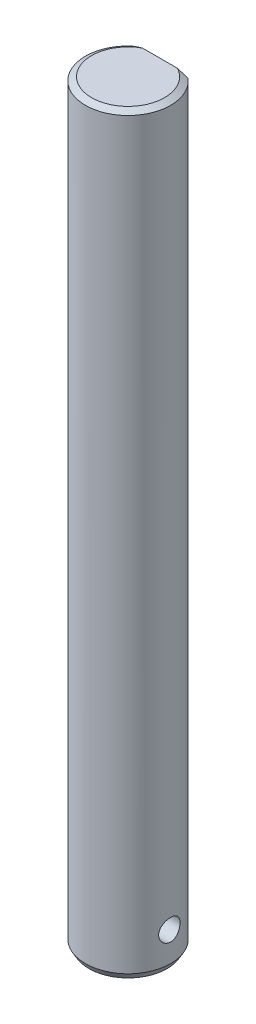
ISO-10303-21;
HEADER;
FILE_DESCRIPTION(('STEP AP214'),'2;1');
FILE_NAME('part.step','',(''),(''),'','','');
FILE_SCHEMA(('AUTOMOTIVE_DESIGN { 1 0 10303 214 1 1 1 1 }'));
ENDSEC;
DATA;
#1=APPLICATION_CONTEXT('core data for automotive mechanical design processes');
#2=APPLICATION_PROTOCOL_DEFINITION('international standard','automotive_design',2000,#1);
#3=PRODUCT_CONTEXT('',#1,'mechanical');
#4=PRODUCT('Part','Part','',(#3));
#5=PRODUCT_RELATED_PRODUCT_CATEGORY('part','',(#4));
#6=PRODUCT_DEFINITION_FORMATION('','',#4);
#7=PRODUCT_DEFINITION_CONTEXT('part definition',#1,'design');
#8=PRODUCT_DEFINITION('design','',#6,#7);
#9=PRODUCT_DEFINITION_SHAPE('','',#8);
#10=(LENGTH_UNIT() NAMED_UNIT(*) SI_UNIT(.MILLI.,.METRE.));
#11=(NAMED_UNIT(*) PLANE_ANGLE_UNIT() SI_UNIT($,.RADIAN.));
#12=(NAMED_UNIT(*) SI_UNIT($,.STERADIAN.) SOLID_ANGLE_UNIT());
#13=UNCERTAINTY_MEASURE_WITH_UNIT(LENGTH_MEASURE(1.E-05),#10,'distance_accuracy_value','');
#14=(GEOMETRIC_REPRESENTATION_CONTEXT(3) GLOBAL_UNCERTAINTY_ASSIGNED_CONTEXT((#13)) GLOBAL_UNIT_ASSIGNED_CONTEXT((#10,
#11,#12)) REPRESENTATION_CONTEXT('',''));
#15=CARTESIAN_POINT('',(0.,0.,0.));
#16=DIRECTION('',(0.,0.,1.));
#17=DIRECTION('',(1.,0.,0.));
#18=AXIS2_PLACEMENT_3D('',#15,#16,#17);
#19=CARTESIAN_POINT('',(0.,106.,0.));
#20=DIRECTION('',(0.,-1.,0.));
#21=DIRECTION('',(0.,0.,-1.));
#22=AXIS2_PLACEMENT_3D('',#19,#20,#21);
#23=CYLINDRICAL_SURFACE('',#22,6.);
#24=CARTESIAN_POINT('',(0.,0.866025403784401,0.));
#25=DIRECTION('',(0.,1.,0.));
#26=DIRECTION('',(0.,0.,1.));
#27=AXIS2_PLACEMENT_3D('',#24,#25,#26);
#28=CIRCLE('',#27,6.);
#29=CARTESIAN_POINT('',(0.,0.866025403784401,6.));
#30=VERTEX_POINT('',#29);
#31=EDGE_CURVE('E135',#30,#30,#28,.T.);
#32=ORIENTED_EDGE('',*,*,#31,.T.);
#33=EDGE_LOOP('',(#32));
#34=FACE_BOUND('',#33,.T.);
#35=CARTESIAN_POINT('',(-5.80947501931113,5.,-1.5));
#36=CARTESIAN_POINT('',(-5.80947660051185,5.08283045055477,-1.49999764715507));
#37=CARTESIAN_POINT('',(-5.81126583608348,5.1656869392068,-1.49311574729838));
#38=CARTESIAN_POINT('',(-5.81821117195949,5.32902054690442,-1.46581387527849));
#39=CARTESIAN_POINT('',(-5.82336923173088,5.409496252681,-1.44538602404532));
#40=CARTESIAN_POINT('',(-5.8364323475758,5.56568212291222,-1.39169471977917));
#41=CARTESIAN_POINT('',(-5.84433385614245,5.6413982932314,-1.35844783671268));
#42=CARTESIAN_POINT('',(-5.86198915217285,5.78618651152395,-1.28011268475685));
#43=CARTESIAN_POINT('',(-5.87174301827101,5.85525827724814,-1.23502391313642));
#44=CARTESIAN_POINT('',(-5.89224429813367,5.98631698715732,-1.13322505638713));
#45=CARTESIAN_POINT('',(-5.90300758573818,6.04813616021003,-1.07630213262243));
#46=CARTESIAN_POINT('',(-5.92417725309179,6.16145683661621,-0.952909238460399));
#47=CARTESIAN_POINT('',(-5.93458359939834,6.21295737537305,-0.886438376508185));
#48=CARTESIAN_POINT('',(-5.95404249312349,6.30486528057877,-0.744687120647373));
#49=CARTESIAN_POINT('',(-5.96307412440355,6.34510783289688,-0.669296745717072));
#50=CARTESIAN_POINT('',(-5.9785848715559,6.41228578649185,-0.512557910575657));
#51=CARTESIAN_POINT('',(-5.98506436400607,6.43922315114931,-0.431210331475164));
#52=CARTESIAN_POINT('',(-5.99462855308908,6.47848870074715,-0.266615255252497));
#53=CARTESIAN_POINT('',(-5.99777936306589,6.49110178659595,-0.183439631729385));
#54=CARTESIAN_POINT('',(-6.00056156464379,6.50225502756533,-0.0160972915576615));
#55=CARTESIAN_POINT('',(-6.00019347658022,6.50079726332576,0.0680692767228413));
#56=CARTESIAN_POINT('',(-5.99602856972121,6.48405508984991,0.233028370758581));
#57=CARTESIAN_POINT('',(-5.99230801404524,6.46907820496769,0.313854323401601));
#58=CARTESIAN_POINT('',(-5.98194501914912,6.4262172379709,0.47180737112053));
#59=CARTESIAN_POINT('',(-5.97530242439065,6.39833246877355,0.548934269055658));
#60=CARTESIAN_POINT('',(-5.95972505820537,6.33019845758776,0.69811005525271));
#61=CARTESIAN_POINT('',(-5.95077011817032,6.28983977320295,0.770106764649757));
#62=CARTESIAN_POINT('',(-5.9315394228579,6.19798659253025,0.906413433510734));
#63=CARTESIAN_POINT('',(-5.92126343791494,6.14649015886363,0.970722052628259));
#64=CARTESIAN_POINT('',(-5.90018228261712,6.03217475481057,1.09166105262743));
#65=CARTESIAN_POINT('',(-5.88937031715551,5.96908706459134,1.1480365186128));
#66=CARTESIAN_POINT('',(-5.86869026110024,5.83424001587585,1.24946456394453));
#67=CARTESIAN_POINT('',(-5.85882221463582,5.7624802523054,1.29451661406903));
#68=CARTESIAN_POINT('',(-5.84112298098989,5.61182597951062,1.3721821935339));
#69=CARTESIAN_POINT('',(-5.83330190235432,5.53289856181208,1.40473435045574));
#70=CARTESIAN_POINT('',(-5.82071184083974,5.37044871915413,1.45602843095451));
#71=CARTESIAN_POINT('',(-5.81594220486131,5.28692728161012,1.47477330982937));
#72=CARTESIAN_POINT('',(-5.81013213623485,5.12002429908613,1.49749778319911));
#73=CARTESIAN_POINT('',(-5.80899653456189,5.03669732400222,1.50185428435178));
#74=CARTESIAN_POINT('',(-5.81032406088624,4.8705068380531,1.49671019430933));
#75=CARTESIAN_POINT('',(-5.8127868576076,4.78764328522926,1.48721087870928));
#76=CARTESIAN_POINT('',(-5.82094249172736,4.62613144102718,1.4549552783626));
#77=CARTESIAN_POINT('',(-5.82658182140625,4.54743636405749,1.43241844096905));
#78=CARTESIAN_POINT('',(-5.84040430962577,4.39494112528899,1.37497084900237));
#79=CARTESIAN_POINT('',(-5.84858776949168,4.3211415445668,1.34005862862753));
#80=CARTESIAN_POINT('',(-5.86677682255958,4.17893523327959,1.25806240076193));
#81=CARTESIAN_POINT('',(-5.87681501163985,4.11066269597414,1.21075305230138));
#82=CARTESIAN_POINT('',(-5.8975024984303,3.98288698231919,1.10559043940169));
#83=CARTESIAN_POINT('',(-5.90815189637082,3.92338525000996,1.04773544220816));
#84=CARTESIAN_POINT('',(-5.92918441818964,3.81331337445743,0.921394081477089));
#85=CARTESIAN_POINT('',(-5.93955421237102,3.76300396247071,0.85267792879739));
#86=CARTESIAN_POINT('',(-5.95858329968241,3.67463847982925,0.707554024042014));
#87=CARTESIAN_POINT('',(-5.96724268202376,3.63658177003508,0.631146673436387));
#88=CARTESIAN_POINT('',(-5.98182069442989,3.57413237928324,0.473337302596636));
#89=CARTESIAN_POINT('',(-5.98775898013446,3.54964142937256,0.391976071541822));
#90=CARTESIAN_POINT('',(-5.99631176037473,3.51472379923495,0.226124640478212));
#91=CARTESIAN_POINT('',(-5.99892689636045,3.50429440475657,0.141635047561866));
#92=CARTESIAN_POINT('',(-6.00051254113217,3.4979486156367,-0.0256252896649891));
#93=CARTESIAN_POINT('',(-5.99957968320012,3.50164743635691,-0.108380740449049));
#94=CARTESIAN_POINT('',(-5.99438844686135,3.5225717409415,-0.272051244622109));
#95=CARTESIAN_POINT('',(-5.99013016735643,3.53979682251965,-0.35296635267133));
#96=CARTESIAN_POINT('',(-5.97878149280944,3.58707832965639,-0.510256553467224));
#97=CARTESIAN_POINT('',(-5.97170646753999,3.61706517997194,-0.586653741871528));
#98=CARTESIAN_POINT('',(-5.95546933370076,3.68895586852899,-0.733375579562202));
#99=CARTESIAN_POINT('',(-5.94630696206604,3.73086120900435,-0.803699461897577));
#100=CARTESIAN_POINT('',(-5.92660874521999,3.82657285099561,-0.93810289263585));
#101=CARTESIAN_POINT('',(-5.91604525418417,3.88064021436107,-1.00199248245088));
#102=CARTESIAN_POINT('',(-5.89485973579863,3.9986342779607,-1.11992253040688));
#103=CARTESIAN_POINT('',(-5.88423769428834,4.06256347414686,-1.17396048760228));
#104=CARTESIAN_POINT('',(-5.86391213790822,4.199902121302,-1.27164303971884));
#105=CARTESIAN_POINT('',(-5.85422945594827,4.27346618511894,-1.31507492916982));
#106=CARTESIAN_POINT('',(-5.83715933325924,4.42708323488405,-1.3888903449235));
#107=CARTESIAN_POINT('',(-5.82977022370054,4.50713144916011,-1.41928336463958));
#108=CARTESIAN_POINT('',(-5.81927863109675,4.65586551774007,-1.46163379284816));
#109=CARTESIAN_POINT('',(-5.8156299450082,4.72383974657579,-1.47598975589307));
#110=CARTESIAN_POINT('',(-5.81072757878358,4.86120330349995,-1.4951734388599));
#111=CARTESIAN_POINT('',(-5.80947369434945,4.93059251036759,-1.50000197155828));
#112=CARTESIAN_POINT('',(-5.80947501931113,5.,-1.5));
#113=B_SPLINE_CURVE_WITH_KNOTS('',3,(#35,#36,#37,#38,#39,#40,#41,#42,#43,#44,#45,#46,#47,#48,
#49,#50,#51,#52,#53,#54,#55,#56,#57,#58,#59,#60,#61,#62,#63,#64,#65,#66,#67,#68,#69,#70,#71,#72,
#73,#74,#75,#76,#77,#78,#79,#80,#81,#82,#83,#84,#85,#86,#87,#88,#89,#90,#91,#92,#93,#94,#95,#96,
#97,#98,#99,#100,#101,#102,#103,#104,#105,#106,#107,#108,#109,#110,#111,#112),.UNSPECIFIED.,.T.,
.F.,(4,2,2,2,2,2,2,2,2,2,2,2,2,2,2,2,2,2,2,2,2,2,2,2,2,2,2,2,2,2,2,2,2,2,2,2,2,2,4),(0.,
0.248236465041681,0.4966174448572,0.744678436299612,0.99274996053287,1.24574372515786,
1.4987611288792,1.75530897838752,2.01181895908255,2.26313250597208,2.51440889199612,
2.76010957613368,3.00582334034872,3.25375724552667,3.50173431281348,3.75642279943147,
4.01112318719882,4.26705859205042,4.52293920077729,4.7720614485703,5.02116076310281,
5.26618443005524,5.51123712852851,5.76109707515494,6.01099811331027,6.26715198579192,
6.52329249431732,6.77755243684158,7.03176329345423,7.27910067676474,7.52643070426189,
7.77242925935827,8.01845883442844,8.27038257949243,8.52237018939306,8.77905886370807,
9.03556032819972,9.24358696306398,9.45159585059713),.UNSPECIFIED.);
#114=CARTESIAN_POINT('',(-5.80947501931113,5.,-1.5));
#115=VERTEX_POINT('',#114);
#116=EDGE_CURVE('E91',#115,#115,#113,.T.);
#117=ORIENTED_EDGE('',*,*,#116,.T.);
#118=EDGE_LOOP('',(#117));
#119=FACE_BOUND('',#118,.T.);
#120=CARTESIAN_POINT('',(5.80947501931113,5.,-1.5));
#121=CARTESIAN_POINT('',(5.80947660051185,4.91716954944523,-1.49999764715507));
#122=CARTESIAN_POINT('',(5.81126583608348,4.8343130607932,-1.49311574729838));
#123=CARTESIAN_POINT('',(5.81821117195949,4.67097945309558,-1.46581387527849));
#124=CARTESIAN_POINT('',(5.82336923173088,4.590503747319,-1.44538602404532));
#125=CARTESIAN_POINT('',(5.8364323475758,4.43431787708778,-1.39169471977917));
#126=CARTESIAN_POINT('',(5.84433385614245,4.3586017067686,-1.35844783671268));
#127=CARTESIAN_POINT('',(5.86198915217285,4.21381348847605,-1.28011268475685));
#128=CARTESIAN_POINT('',(5.87174301827101,4.14474172275186,-1.23502391313642));
#129=CARTESIAN_POINT('',(5.89224429813367,4.01368301284268,-1.13322505638713));
#130=CARTESIAN_POINT('',(5.90300758573818,3.95186383978997,-1.07630213262243));
#131=CARTESIAN_POINT('',(5.92417725309178,3.83854316338379,-0.952909238460399));
#132=CARTESIAN_POINT('',(5.93458359939834,3.78704262462695,-0.886438376508185));
#133=CARTESIAN_POINT('',(5.95404249312349,3.69513471942123,-0.744687120647373));
#134=CARTESIAN_POINT('',(5.96307412440355,3.65489216710312,-0.669296745717072));
#135=CARTESIAN_POINT('',(5.97858487155591,3.58771421350815,-0.512557910575658));
#136=CARTESIAN_POINT('',(5.98506436400607,3.56077684885069,-0.431210331475164));
#137=CARTESIAN_POINT('',(5.99462855308908,3.52151129925285,-0.266615255252497));
#138=CARTESIAN_POINT('',(5.99777936306589,3.50889821340405,-0.183439631729385));
#139=CARTESIAN_POINT('',(6.00056156464379,3.49774497243467,-0.0160972915576617));
#140=CARTESIAN_POINT('',(6.00019347658022,3.49920273667424,0.0680692767228411));
#141=CARTESIAN_POINT('',(5.99602856972121,3.51594491015009,0.233028370758581));
#142=CARTESIAN_POINT('',(5.99230801404524,3.53092179503231,0.3138543234016));
#143=CARTESIAN_POINT('',(5.98194501914912,3.5737827620291,0.471807371120529));
#144=CARTESIAN_POINT('',(5.97530242439065,3.60166753122645,0.548934269055657));
#145=CARTESIAN_POINT('',(5.95972505820537,3.66980154241224,0.69811005525271));
#146=CARTESIAN_POINT('',(5.95077011817032,3.71016022679705,0.770106764649757));
#147=CARTESIAN_POINT('',(5.9315394228579,3.80201340746975,0.906413433510733));
#148=CARTESIAN_POINT('',(5.92126343791494,3.85350984113637,0.970722052628258));
#149=CARTESIAN_POINT('',(5.90018228261712,3.96782524518943,1.09166105262743));
#150=CARTESIAN_POINT('',(5.88937031715551,4.03091293540866,1.1480365186128));
#151=CARTESIAN_POINT('',(5.86869026110024,4.16575998412415,1.24946456394453));
#152=CARTESIAN_POINT('',(5.85882221463582,4.2375197476946,1.29451661406902));
#153=CARTESIAN_POINT('',(5.84112298098989,4.38817402048938,1.3721821935339));
#154=CARTESIAN_POINT('',(5.83330190235432,4.46710143818792,1.40473435045574));
#155=CARTESIAN_POINT('',(5.82071184083974,4.62955128084587,1.45602843095451));
#156=CARTESIAN_POINT('',(5.81594220486131,4.71307271838988,1.47477330982937));
#157=CARTESIAN_POINT('',(5.81013213623485,4.87997570091387,1.49749778319911));
#158=CARTESIAN_POINT('',(5.80899653456189,4.96330267599778,1.50185428435178));
#159=CARTESIAN_POINT('',(5.81032406088624,5.1294931619469,1.49671019430933));
#160=CARTESIAN_POINT('',(5.8127868576076,5.21235671477074,1.48721087870928));
#161=CARTESIAN_POINT('',(5.82094249172736,5.37386855897282,1.4549552783626));
#162=CARTESIAN_POINT('',(5.82658182140625,5.45256363594251,1.43241844096905));
#163=CARTESIAN_POINT('',(5.84040430962577,5.60505887471101,1.37497084900237));
#164=CARTESIAN_POINT('',(5.84858776949168,5.6788584554332,1.34005862862753));
#165=CARTESIAN_POINT('',(5.86677682255958,5.82106476672041,1.25806240076193));
#166=CARTESIAN_POINT('',(5.87681501163985,5.88933730402586,1.21075305230138));
#167=CARTESIAN_POINT('',(5.8975024984303,6.01711301768081,1.10559043940168));
#168=CARTESIAN_POINT('',(5.90815189637082,6.07661474999005,1.04773544220816));
#169=CARTESIAN_POINT('',(5.92918441818964,6.18668662554257,0.921394081477089));
#170=CARTESIAN_POINT('',(5.93955421237102,6.23699603752929,0.852677928797389));
#171=CARTESIAN_POINT('',(5.95858329968241,6.32536152017075,0.707554024042013));
#172=CARTESIAN_POINT('',(5.96724268202376,6.36341822996492,0.631146673436387));
#173=CARTESIAN_POINT('',(5.98182069442989,6.42586762071676,0.473337302596636));
#174=CARTESIAN_POINT('',(5.98775898013446,6.45035857062744,0.391976071541822));
#175=CARTESIAN_POINT('',(5.99631176037473,6.48527620076505,0.226124640478212));
#176=CARTESIAN_POINT('',(5.99892689636045,6.49570559524343,0.141635047561866));
#177=CARTESIAN_POINT('',(6.00051254113217,6.5020513843633,-0.0256252896649895));
#178=CARTESIAN_POINT('',(5.99957968320012,6.49835256364309,-0.10838074044905));
#179=CARTESIAN_POINT('',(5.99438844686135,6.4774282590585,-0.27205124462211));
#180=CARTESIAN_POINT('',(5.99013016735643,6.46020317748035,-0.35296635267133));
#181=CARTESIAN_POINT('',(5.97878149280944,6.41292167034361,-0.510256553467224));
#182=CARTESIAN_POINT('',(5.97170646753999,6.38293482002806,-0.586653741871529));
#183=CARTESIAN_POINT('',(5.95546933370076,6.31104413147101,-0.733375579562203));
#184=CARTESIAN_POINT('',(5.94630696206604,6.26913879099565,-0.803699461897577));
#185=CARTESIAN_POINT('',(5.92660874521999,6.17342714900439,-0.938102892635849));
#186=CARTESIAN_POINT('',(5.91604525418417,6.11935978563893,-1.00199248245088));
#187=CARTESIAN_POINT('',(5.89485973579863,6.0013657220393,-1.11992253040688));
#188=CARTESIAN_POINT('',(5.88423769428834,5.93743652585314,-1.17396048760228));
#189=CARTESIAN_POINT('',(5.86391213790822,5.800097878698,-1.27164303971884));
#190=CARTESIAN_POINT('',(5.85422945594827,5.72653381488106,-1.31507492916982));
#191=CARTESIAN_POINT('',(5.83715933325924,5.57291676511595,-1.3888903449235));
#192=CARTESIAN_POINT('',(5.82977022370054,5.49286855083989,-1.41928336463958));
#193=CARTESIAN_POINT('',(5.81927863109675,5.34413448225992,-1.46163379284816));
#194=CARTESIAN_POINT('',(5.8156299450082,5.27616025342421,-1.47598975589307));
#195=CARTESIAN_POINT('',(5.81072757878358,5.13879669650006,-1.4951734388599));
#196=CARTESIAN_POINT('',(5.80947369434945,5.06940748963241,-1.50000197155828));
#197=CARTESIAN_POINT('',(5.80947501931113,5.,-1.5));
#198=B_SPLINE_CURVE_WITH_KNOTS('',3,(#120,#121,#122,#123,#124,#125,#126,#127,#128,#129,#130,
#131,#132,#133,#134,#135,#136,#137,#138,#139,#140,#141,#142,#143,#144,#145,#146,#147,#148,#149,
#150,#151,#152,#153,#154,#155,#156,#157,#158,#159,#160,#161,#162,#163,#164,#165,#166,#167,#168,
#169,#170,#171,#172,#173,#174,#175,#176,#177,#178,#179,#180,#181,#182,#183,#184,#185,#186,#187,
#188,#189,#190,#191,#192,#193,#194,#195,#196,#197),.UNSPECIFIED.,.T.,.F.,(4,2,2,2,2,2,2,2,2,2,2,
2,2,2,2,2,2,2,2,2,2,2,2,2,2,2,2,2,2,2,2,2,2,2,2,2,2,2,4),(0.,0.248236465041681,0.4966174448572,
0.744678436299612,0.99274996053287,1.24574372515786,1.4987611288792,1.75530897838752,
2.01181895908255,2.26313250597208,2.51440889199612,2.76010957613368,3.00582334034872,
3.25375724552667,3.50173431281348,3.75642279943147,4.01112318719881,4.26705859205041,
4.52293920077729,4.7720614485703,5.02116076310281,5.26618443005524,5.5112371285285,
5.76109707515494,6.01099811331027,6.26715198579191,6.52329249431732,6.77755243684157,
7.03176329345423,7.27910067676474,7.52643070426189,7.77242925935826,8.01845883442843,
8.27038257949242,8.52237018939305,8.77905886370806,9.03556032819972,9.24358696306398,
9.45159585059712),.UNSPECIFIED.);
#199=CARTESIAN_POINT('',(5.80947501931113,5.,-1.5));
#200=VERTEX_POINT('',#199);
#201=EDGE_CURVE('E95',#200,#200,#198,.T.);
#202=ORIENTED_EDGE('',*,*,#201,.T.);
#203=EDGE_LOOP('',(#202));
#204=FACE_BOUND('',#203,.T.);
#205=DIRECTION('',(0.,-1.,0.));
#206=VECTOR('',#205,1.);
#207=CARTESIAN_POINT('',(3.96862696659689,106.,-4.5));
#208=LINE('',#207,#206);
#209=CARTESIAN_POINT('',(3.96862696659689,96.,-4.5));
#210=VERTEX_POINT('',#209);
#211=CARTESIAN_POINT('',(3.96862696659689,105.5,-4.5));
#212=VERTEX_POINT('',#211);
#213=EDGE_CURVE('E83',#210,#212,#208,.F.);
#214=ORIENTED_EDGE('',*,*,#213,.T.);
#215=CARTESIAN_POINT('',(0.,105.5,0.));
#216=DIRECTION('',(0.,1.,0.));
#217=DIRECTION('',(0.,0.,1.));
#218=AXIS2_PLACEMENT_3D('',#215,#216,#217);
#219=CIRCLE('',#218,6.);
#220=CARTESIAN_POINT('',(-3.96862696659689,105.5,-4.5));
#221=VERTEX_POINT('',#220);
#222=EDGE_CURVE('E80',#212,#221,#219,.F.);
#223=ORIENTED_EDGE('',*,*,#222,.T.);
#224=DIRECTION('',(0.,-1.,0.));
#225=VECTOR('',#224,1.);
#226=CARTESIAN_POINT('',(-3.96862696659689,106.,-4.5));
#227=LINE('',#226,#225);
#228=CARTESIAN_POINT('',(-3.96862696659689,96.,-4.5));
#229=VERTEX_POINT('',#228);
#230=EDGE_CURVE('E76',#221,#229,#227,.T.);
#231=ORIENTED_EDGE('',*,*,#230,.T.);
#232=CARTESIAN_POINT('',(0.,96.,0.));
#233=DIRECTION('',(0.,1.,0.));
#234=DIRECTION('',(0.,0.,1.));
#235=AXIS2_PLACEMENT_3D('',#232,#233,#234);
#236=CIRCLE('',#235,6.);
#237=EDGE_CURVE('E79',#210,#229,#236,.T.);
#238=ORIENTED_EDGE('',*,*,#237,.F.);
#239=EDGE_LOOP('',(#214,#223,#231,#238));
#240=FACE_BOUND('',#239,.T.);
#241=ADVANCED_FACE('F35',(#34,#119,#204,#240),#23,.T.);
#242=CARTESIAN_POINT('',(0.,106.,0.));
#243=DIRECTION('',(0.,1.,0.));
#244=DIRECTION('',(0.,0.,1.));
#245=AXIS2_PLACEMENT_3D('',#242,#243,#244);
#246=PLANE('',#245);
#247=DIRECTION('',(1.,0.,0.));
#248=VECTOR('',#247,1.);
#249=CARTESIAN_POINT('',(0.,106.,-4.5));
#250=LINE('',#249,#248);
#251=CARTESIAN_POINT('',(-2.47137515456208,106.,-4.5));
#252=VERTEX_POINT('',#251);
#253=CARTESIAN_POINT('',(2.47137515456208,106.,-4.5));
#254=VERTEX_POINT('',#253);
#255=EDGE_CURVE('E82',#252,#254,#250,.T.);
#256=ORIENTED_EDGE('',*,*,#255,.F.);
#257=CARTESIAN_POINT('',(0.,106.,0.));
#258=DIRECTION('',(0.,1.,0.));
#259=DIRECTION('',(0.,0.,1.));
#260=AXIS2_PLACEMENT_3D('',#257,#258,#259);
#261=CIRCLE('',#260,5.13397459621556);
#262=EDGE_CURVE('E130',#252,#254,#261,.T.);
#263=ORIENTED_EDGE('',*,*,#262,.T.);
#264=EDGE_LOOP('',(#256,#263));
#265=FACE_BOUND('',#264,.T.);
#266=ADVANCED_FACE('F123',(#265),#246,.T.);
#267=CARTESIAN_POINT('',(0.,0.,0.));
#268=DIRECTION('',(0.,1.,0.));
#269=DIRECTION('',(0.,0.,1.));
#270=AXIS2_PLACEMENT_3D('',#267,#268,#269);
#271=PLANE('',#270);
#272=CARTESIAN_POINT('',(0.,0.,0.));
#273=DIRECTION('',(0.,1.,0.));
#274=DIRECTION('',(0.,0.,1.));
#275=AXIS2_PLACEMENT_3D('',#272,#273,#274);
#276=CIRCLE('',#275,5.50000000000003);
#277=CARTESIAN_POINT('',(0.,0.,5.50000000000003));
#278=VERTEX_POINT('',#277);
#279=EDGE_CURVE('E132',#278,#278,#276,.F.);
#280=ORIENTED_EDGE('',*,*,#279,.T.);
#281=EDGE_LOOP('',(#280));
#282=FACE_BOUND('',#281,.T.);
#283=ADVANCED_FACE('F119',(#282),#271,.F.);
#284=CARTESIAN_POINT('',(0.,96.,0.));
#285=DIRECTION('',(0.,1.,0.));
#286=DIRECTION('',(0.,0.,1.));
#287=AXIS2_PLACEMENT_3D('',#284,#285,#286);
#288=PLANE('',#287);
#289=ORIENTED_EDGE('',*,*,#237,.T.);
#290=DIRECTION('',(1.,0.,0.));
#291=VECTOR('',#290,1.);
#292=CARTESIAN_POINT('',(-6.10820757707984,96.,-4.5));
#293=LINE('',#292,#291);
#294=EDGE_CURVE('E88',#229,#210,#293,.T.);
#295=ORIENTED_EDGE('',*,*,#294,.T.);
#296=EDGE_LOOP('',(#289,#295));
#297=FACE_BOUND('',#296,.T.);
#298=ADVANCED_FACE('F87',(#297),#288,.T.);
#299=CARTESIAN_POINT('',(-6.10820757707984,96.,-4.5));
#300=DIRECTION('',(0.,0.,1.));
#301=DIRECTION('',(1.,0.,0.));
#302=AXIS2_PLACEMENT_3D('',#299,#300,#301);
#303=PLANE('',#302);
#304=ORIENTED_EDGE('',*,*,#255,.T.);
#305=CARTESIAN_POINT('',(2.47137515456208,106.,-4.5));
#306=CARTESIAN_POINT('',(2.59821029234091,105.964741067028,-4.5));
#307=CARTESIAN_POINT('',(2.72449842776643,105.927566203446,-4.5));
#308=CARTESIAN_POINT('',(2.97597185015973,105.849882020878,-4.5));
#309=CARTESIAN_POINT('',(3.10115769990573,105.809374527543,-4.5));
#310=CARTESIAN_POINT('',(3.35054029678143,105.725488234176,-4.5));
#311=CARTESIAN_POINT('',(3.47473716361617,105.682109787745,-4.5));
#312=CARTESIAN_POINT('',(3.72230196848673,105.592839293428,-4.5));
#313=CARTESIAN_POINT('',(3.84566941885811,105.54694589105,-4.5));
#314=CARTESIAN_POINT('',(3.96862696659689,105.5,-4.5));
#315=B_SPLINE_CURVE_WITH_KNOTS('',3,(#305,#306,#307,#308,#309,#310,#311,#312,#313,#314),
.UNSPECIFIED.,.F.,.F.,(4,2,2,2,4),(0.,0.394899349737702,0.789583791657925,1.18421971236831,
1.57907030390004),.UNSPECIFIED.);
#316=EDGE_CURVE('E11',#254,#212,#315,.T.);
#317=ORIENTED_EDGE('',*,*,#316,.T.);
#318=ORIENTED_EDGE('',*,*,#213,.F.);
#319=ORIENTED_EDGE('',*,*,#294,.F.);
#320=ORIENTED_EDGE('',*,*,#230,.F.);
#321=CARTESIAN_POINT('',(-3.96862696659689,105.5,-4.5));
#322=CARTESIAN_POINT('',(-3.84566941885811,105.54694589105,-4.5));
#323=CARTESIAN_POINT('',(-3.72230196848673,105.592839293428,-4.5));
#324=CARTESIAN_POINT('',(-3.47473716361617,105.682109787745,-4.5));
#325=CARTESIAN_POINT('',(-3.35054029678143,105.725488234176,-4.5));
#326=CARTESIAN_POINT('',(-3.10115769990573,105.809374527543,-4.5));
#327=CARTESIAN_POINT('',(-2.97597185015973,105.849882020878,-4.5));
#328=CARTESIAN_POINT('',(-2.72449842776643,105.927566203446,-4.5));
#329=CARTESIAN_POINT('',(-2.59821029234091,105.964741067028,-4.5));
#330=CARTESIAN_POINT('',(-2.47137515456208,106.,-4.5));
#331=B_SPLINE_CURVE_WITH_KNOTS('',3,(#321,#322,#323,#324,#325,#326,#327,#328,#329,#330),
.UNSPECIFIED.,.F.,.F.,(4,2,2,2,4),(0.,0.394850591531729,0.789486512242111,1.18417095416234,
1.57907030390004),.UNSPECIFIED.);
#332=EDGE_CURVE('E50',#221,#252,#331,.T.);
#333=ORIENTED_EDGE('',*,*,#332,.T.);
#334=EDGE_LOOP('',(#304,#317,#318,#319,#320,#333));
#335=FACE_BOUND('',#334,.T.);
#336=ADVANCED_FACE('F90',(#335),#303,.F.);
#337=CARTESIAN_POINT('',(-50.,5.,0.));
#338=DIRECTION('',(1.,0.,0.));
#339=DIRECTION('',(0.,0.,-1.));
#340=AXIS2_PLACEMENT_3D('',#337,#338,#339);
#341=CYLINDRICAL_SURFACE('',#340,1.5);
#342=ORIENTED_EDGE('',*,*,#201,.F.);
#343=EDGE_LOOP('',(#342));
#344=FACE_BOUND('',#343,.T.);
#345=ORIENTED_EDGE('',*,*,#116,.F.);
#346=EDGE_LOOP('',(#345));
#347=FACE_BOUND('',#346,.T.);
#348=ADVANCED_FACE('F111',(#344,#347),#341,.F.);
#349=CARTESIAN_POINT('',(0.,0.866025403784401,0.));
#350=DIRECTION('',(0.,1.,0.));
#351=DIRECTION('',(0.,0.,1.));
#352=AXIS2_PLACEMENT_3D('',#349,#350,#351);
#353=CONICAL_SURFACE('',#352,6.,0.523598775598296);
#354=CARTESIAN_POINT('',(0.,0.,5.50000000000003));
#355=CARTESIAN_POINT('',(0.,0.00902109795608741,5.50520833333336));
#356=CARTESIAN_POINT('',(0.,0.0180421959121749,5.51041666666669));
#357=CARTESIAN_POINT('',(0.,0.0360843918243499,5.52083333333336));
#358=CARTESIAN_POINT('',(0.,0.0451054897804374,5.52604166666669));
#359=CARTESIAN_POINT('',(0.,0.0631476856926125,5.53645833333336));
#360=CARTESIAN_POINT('',(0.,0.0721687836487,5.54166666666669));
#361=CARTESIAN_POINT('',(0.,0.090210979560875,5.55208333333336));
#362=CARTESIAN_POINT('',(0.,0.0992320775169625,5.55729166666669));
#363=CARTESIAN_POINT('',(0.,0.117274273429138,5.56770833333336));
#364=CARTESIAN_POINT('',(0.,0.126295371385225,5.57291666666669));
#365=CARTESIAN_POINT('',(0.,0.1443375672974,5.58333333333335));
#366=CARTESIAN_POINT('',(0.,0.153358665253488,5.58854166666669));
#367=CARTESIAN_POINT('',(0.,0.171400861165663,5.59895833333335));
#368=CARTESIAN_POINT('',(0.,0.18042195912175,5.60416666666669));
#369=CARTESIAN_POINT('',(0.,0.198464155033925,5.61458333333335));
#370=CARTESIAN_POINT('',(0.,0.207485252990013,5.61979166666669));
#371=CARTESIAN_POINT('',(0.,0.225527448902188,5.63020833333335));
#372=CARTESIAN_POINT('',(0.,0.234548546858275,5.63541666666669));
#373=CARTESIAN_POINT('',(0.,0.25259074277045,5.64583333333335));
#374=CARTESIAN_POINT('',(0.,0.261611840726538,5.65104166666669));
#375=CARTESIAN_POINT('',(0.,0.279654036638713,5.66145833333335));
#376=CARTESIAN_POINT('',(0.,0.2886751345948,5.66666666666668));
#377=CARTESIAN_POINT('',(0.,0.306717330506975,5.67708333333335));
#378=CARTESIAN_POINT('',(0.,0.315738428463063,5.68229166666668));
#379=CARTESIAN_POINT('',(0.,0.333780624375238,5.69270833333335));
#380=CARTESIAN_POINT('',(0.,0.342801722331325,5.69791666666668));
#381=CARTESIAN_POINT('',(0.,0.3608439182435,5.70833333333335));
#382=CARTESIAN_POINT('',(0.,0.369865016199588,5.71354166666668));
#383=CARTESIAN_POINT('',(0.,0.387907212111763,5.72395833333335));
#384=CARTESIAN_POINT('',(0.,0.39692831006785,5.72916666666668));
#385=CARTESIAN_POINT('',(0.,0.414970505980026,5.73958333333335));
#386=CARTESIAN_POINT('',(0.,0.423991603936113,5.74479166666668));
#387=CARTESIAN_POINT('',(0.,0.442033799848288,5.75520833333335));
#388=CARTESIAN_POINT('',(0.,0.451054897804375,5.76041666666668));
#389=CARTESIAN_POINT('',(0.,0.469097093716551,5.77083333333335));
#390=CARTESIAN_POINT('',(0.,0.478118191672638,5.77604166666668));
#391=CARTESIAN_POINT('',(0.,0.496160387584813,5.78645833333334));
#392=CARTESIAN_POINT('',(0.,0.505181485540901,5.79166666666668));
#393=CARTESIAN_POINT('',(0.,0.523223681453076,5.80208333333334));
#394=CARTESIAN_POINT('',(0.,0.532244779409163,5.80729166666668));
#395=CARTESIAN_POINT('',(0.,0.550286975321338,5.81770833333334));
#396=CARTESIAN_POINT('',(0.,0.559308073277426,5.82291666666668));
#397=CARTESIAN_POINT('',(0.,0.577350269189601,5.83333333333334));
#398=CARTESIAN_POINT('',(0.,0.586371367145688,5.83854166666668));
#399=CARTESIAN_POINT('',(0.,0.604413563057863,5.84895833333334));
#400=CARTESIAN_POINT('',(0.,0.613434661013951,5.85416666666667));
#401=CARTESIAN_POINT('',(0.,0.631476856926126,5.86458333333334));
#402=CARTESIAN_POINT('',(0.,0.640497954882213,5.86979166666667));
#403=CARTESIAN_POINT('',(0.,0.658540150794388,5.88020833333334));
#404=CARTESIAN_POINT('',(0.,0.667561248750476,5.88541666666667));
#405=CARTESIAN_POINT('',(0.,0.685603444662651,5.89583333333334));
#406=CARTESIAN_POINT('',(0.,0.694624542618739,5.90104166666667));
#407=CARTESIAN_POINT('',(0.,0.712666738530914,5.91145833333334));
#408=CARTESIAN_POINT('',(0.,0.721687836487001,5.91666666666667));
#409=CARTESIAN_POINT('',(0.,0.739730032399176,5.92708333333334));
#410=CARTESIAN_POINT('',(0.,0.748751130355263,5.93229166666667));
#411=CARTESIAN_POINT('',(0.,0.766793326267439,5.94270833333334));
#412=CARTESIAN_POINT('',(0.,0.775814424223526,5.94791666666667));
#413=CARTESIAN_POINT('',(0.,0.793856620135701,5.95833333333334));
#414=CARTESIAN_POINT('',(0.,0.802877718091789,5.96354166666667));
#415=CARTESIAN_POINT('',(0.,0.820919914003964,5.97395833333334));
#416=CARTESIAN_POINT('',(0.,0.829941011960051,5.97916666666667));
#417=CARTESIAN_POINT('',(0.,0.847983207872226,5.98958333333333));
#418=CARTESIAN_POINT('',(0.,0.857004305828314,5.99479166666667));
#419=CARTESIAN_POINT('',(0.,0.866025403784401,6.));
#420=B_SPLINE_CURVE_WITH_KNOTS('',3,(#354,#355,#356,#357,#358,#359,#360,#361,#362,#363,#364,
#365,#366,#367,#368,#369,#370,#371,#372,#373,#374,#375,#376,#377,#378,#379,#380,#381,#382,#383,
#384,#385,#386,#387,#388,#389,#390,#391,#392,#393,#394,#395,#396,#397,#398,#399,#400,#401,#402,
#403,#404,#405,#406,#407,#408,#409,#410,#411,#412,#413,#414,#415,#416,#417,#418,#419),
.UNSPECIFIED.,.F.,.F.,(4,2,2,2,2,2,2,2,2,2,2,2,2,2,2,2,2,2,2,2,2,2,2,2,2,2,2,2,2,2,2,2,4),(0.,
0.0312499999999986,0.0624999999999971,0.0937499999999957,0.124999999999994,0.156249999999993,
0.187499999999991,0.21874999999999,0.249999999999989,0.281249999999987,0.312499999999986,
0.343749999999985,0.374999999999983,0.406249999999982,0.43749999999998,0.468749999999979,
0.499999999999977,0.531249999999976,0.562499999999975,0.593749999999974,0.624999999999972,
0.656249999999971,0.687499999999969,0.718749999999968,0.749999999999966,0.781249999999965,
0.812499999999963,0.843749999999962,0.874999999999961,0.906249999999959,0.937499999999958,
0.968749999999956,0.999999999999955),.UNSPECIFIED.);
#421=EDGE_CURVE('BSEAM115',#278,#30,#420,.T.);
#422=ORIENTED_EDGE('',*,*,#279,.F.);
#423=ORIENTED_EDGE('',*,*,#31,.F.);
#424=ORIENTED_EDGE('',*,*,#421,.T.);
#425=ORIENTED_EDGE('',*,*,#421,.F.);
#426=EDGE_LOOP('',(#422,#424,#423,#425));
#427=FACE_BOUND('',#426,.T.);
#428=ADVANCED_FACE('F115',(#427),#353,.T.);
#429=CARTESIAN_POINT('',(0.,106.,0.));
#430=DIRECTION('',(0.,-1.,0.));
#431=DIRECTION('',(0.,0.,-1.));
#432=AXIS2_PLACEMENT_3D('',#429,#430,#431);
#433=CONICAL_SURFACE('',#432,5.13397459621556,1.04719755119659);
#434=ORIENTED_EDGE('',*,*,#332,.F.);
#435=ORIENTED_EDGE('',*,*,#222,.F.);
#436=ORIENTED_EDGE('',*,*,#316,.F.);
#437=ORIENTED_EDGE('',*,*,#262,.F.);
#438=EDGE_LOOP('',(#434,#435,#436,#437));
#439=FACE_BOUND('',#438,.T.);
#440=ADVANCED_FACE('F38',(#439),#433,.T.);
#441=CLOSED_SHELL('',(#241,#266,#283,#298,#336,#348,#428,#440));
#442=MANIFOLD_SOLID_BREP('B2',#441);
#443=ADVANCED_BREP_SHAPE_REPRESENTATION('',(#18,#442),#14);
#444=SHAPE_DEFINITION_REPRESENTATION(#9,#443);
ENDSEC;
END-ISO-10303-21;
